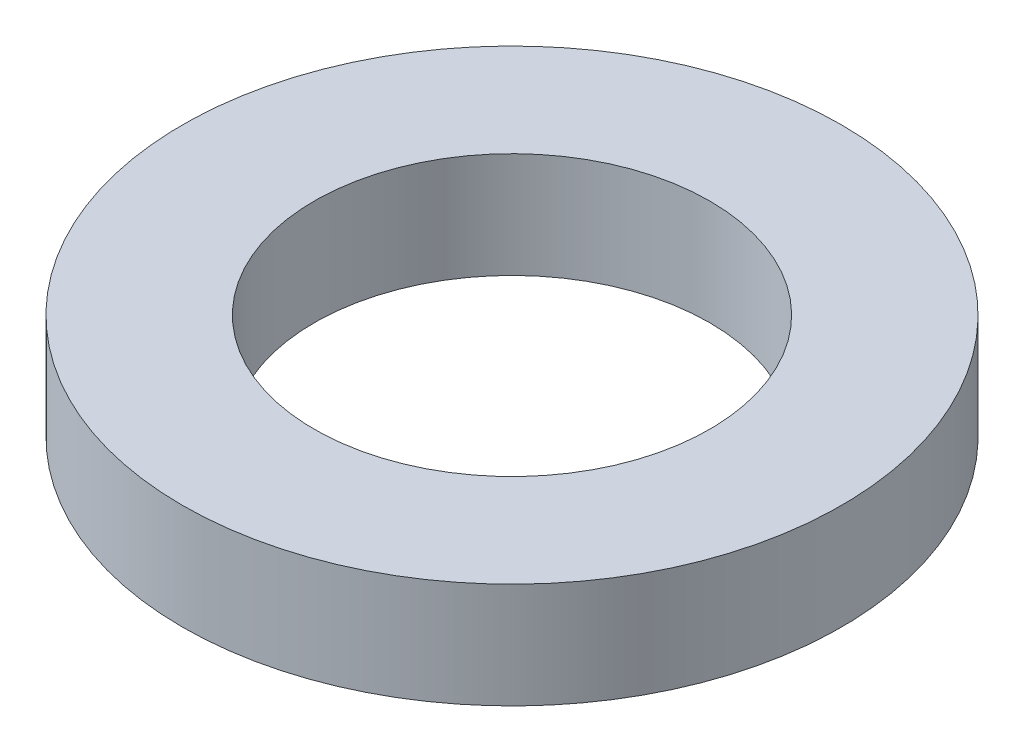
ISO-10303-21;
HEADER;
FILE_DESCRIPTION(('STEP AP214'),'2;1');
FILE_NAME('part.step','',(''),(''),'','','');
FILE_SCHEMA(('AUTOMOTIVE_DESIGN { 1 0 10303 214 1 1 1 1 }'));
ENDSEC;
DATA;
#1=APPLICATION_CONTEXT('core data for automotive mechanical design processes');
#2=APPLICATION_PROTOCOL_DEFINITION('international standard','automotive_design',2000,#1);
#3=PRODUCT_CONTEXT('',#1,'mechanical');
#4=PRODUCT('Part','Part','',(#3));
#5=PRODUCT_RELATED_PRODUCT_CATEGORY('part','',(#4));
#6=PRODUCT_DEFINITION_FORMATION('','',#4);
#7=PRODUCT_DEFINITION_CONTEXT('part definition',#1,'design');
#8=PRODUCT_DEFINITION('design','',#6,#7);
#9=PRODUCT_DEFINITION_SHAPE('','',#8);
#10=(LENGTH_UNIT() NAMED_UNIT(*) SI_UNIT(.MILLI.,.METRE.));
#11=(NAMED_UNIT(*) PLANE_ANGLE_UNIT() SI_UNIT($,.RADIAN.));
#12=(NAMED_UNIT(*) SI_UNIT($,.STERADIAN.) SOLID_ANGLE_UNIT());
#13=UNCERTAINTY_MEASURE_WITH_UNIT(LENGTH_MEASURE(1.E-05),#10,'distance_accuracy_value','');
#14=(GEOMETRIC_REPRESENTATION_CONTEXT(3) GLOBAL_UNCERTAINTY_ASSIGNED_CONTEXT((#13)) GLOBAL_UNIT_ASSIGNED_CONTEXT((#10,
#11,#12)) REPRESENTATION_CONTEXT('',''));
#15=CARTESIAN_POINT('',(0.,0.,0.));
#16=DIRECTION('',(0.,0.,1.));
#17=DIRECTION('',(1.,0.,0.));
#18=AXIS2_PLACEMENT_3D('',#15,#16,#17);
#19=CARTESIAN_POINT('',(-4.547474E-13,683.132012286217,-379.357743681072));
#20=DIRECTION('',(0.,1.,0.));
#21=DIRECTION('',(0.,0.,1.));
#22=AXIS2_PLACEMENT_3D('',#19,#20,#21);
#23=PLANE('',#22);
#24=CARTESIAN_POINT('',(-4.5449628552E-13,683.132012286217,-379.357743681072));
#25=DIRECTION('',(0.,-1.,0.));
#26=DIRECTION('',(0.,0.,-1.));
#27=AXIS2_PLACEMENT_3D('',#24,#25,#26);
#28=CIRCLE('',#27,1.5);
#29=CARTESIAN_POINT('',(-4.5449628552E-13,683.132012286217,-380.857743681072));
#30=VERTEX_POINT('',#29);
#31=EDGE_CURVE('E27',#30,#30,#28,.T.);
#32=ORIENTED_EDGE('',*,*,#31,.T.);
#33=EDGE_LOOP('',(#32));
#34=FACE_BOUND('',#33,.T.);
#35=CARTESIAN_POINT('',(-4.5449628552E-13,683.132012286217,-379.357743681072));
#36=DIRECTION('',(0.,1.,0.));
#37=DIRECTION('',(0.,0.,1.));
#38=AXIS2_PLACEMENT_3D('',#35,#36,#37);
#39=CIRCLE('',#38,2.5);
#40=CARTESIAN_POINT('',(-4.5449628552E-13,683.132012286217,-376.857743681072));
#41=VERTEX_POINT('',#40);
#42=EDGE_CURVE('E18',#41,#41,#39,.F.);
#43=ORIENTED_EDGE('',*,*,#42,.F.);
#44=EDGE_LOOP('',(#43));
#45=FACE_BOUND('',#44,.T.);
#46=ADVANCED_FACE('F15',(#34,#45),#23,.T.);
#47=CARTESIAN_POINT('',(-4.547474E-13,682.732012286217,-379.357743681072));
#48=DIRECTION('',(0.,1.,0.));
#49=DIRECTION('',(0.,0.,1.));
#50=AXIS2_PLACEMENT_3D('',#47,#48,#49);
#51=CYLINDRICAL_SURFACE('',#50,2.5);
#52=CARTESIAN_POINT('',(-4.5499851448E-13,682.332012286217,-379.357743681072));
#53=DIRECTION('',(0.,1.,0.));
#54=DIRECTION('',(0.,0.,1.));
#55=AXIS2_PLACEMENT_3D('',#52,#53,#54);
#56=CIRCLE('',#55,2.5);
#57=CARTESIAN_POINT('',(-4.5499851448E-13,682.332012286217,-376.857743681072));
#58=VERTEX_POINT('',#57);
#59=EDGE_CURVE('E22',#58,#58,#56,.F.);
#60=ORIENTED_EDGE('',*,*,#59,.F.);
#61=EDGE_LOOP('',(#60));
#62=FACE_BOUND('',#61,.T.);
#63=ORIENTED_EDGE('',*,*,#42,.T.);
#64=EDGE_LOOP('',(#63));
#65=FACE_BOUND('',#64,.T.);
#66=ADVANCED_FACE('F35',(#62,#65),#51,.T.);
#67=CARTESIAN_POINT('',(-4.547474E-13,682.732012286217,-379.357743681072));
#68=DIRECTION('',(0.,-1.,0.));
#69=DIRECTION('',(0.,0.,-1.));
#70=AXIS2_PLACEMENT_3D('',#67,#68,#69);
#71=CYLINDRICAL_SURFACE('',#70,1.5);
#72=CARTESIAN_POINT('',(-4.5499851448E-13,682.332012286217,-379.357743681072));
#73=DIRECTION('',(0.,-1.,0.));
#74=DIRECTION('',(0.,0.,-1.));
#75=AXIS2_PLACEMENT_3D('',#72,#73,#74);
#76=CIRCLE('',#75,1.5);
#77=CARTESIAN_POINT('',(-4.5499851448E-13,682.332012286217,-380.857743681072));
#78=VERTEX_POINT('',#77);
#79=EDGE_CURVE('E10',#78,#78,#76,.F.);
#80=ORIENTED_EDGE('',*,*,#79,.F.);
#81=EDGE_LOOP('',(#80));
#82=FACE_BOUND('',#81,.T.);
#83=ORIENTED_EDGE('',*,*,#31,.F.);
#84=EDGE_LOOP('',(#83));
#85=FACE_BOUND('',#84,.T.);
#86=ADVANCED_FACE('F42',(#82,#85),#71,.F.);
#87=CARTESIAN_POINT('',(-4.547474E-13,682.332012286217,-379.357743681072));
#88=DIRECTION('',(0.,-1.,0.));
#89=DIRECTION('',(0.,0.,-1.));
#90=AXIS2_PLACEMENT_3D('',#87,#88,#89);
#91=PLANE('',#90);
#92=ORIENTED_EDGE('',*,*,#79,.T.);
#93=EDGE_LOOP('',(#92));
#94=FACE_BOUND('',#93,.T.);
#95=ORIENTED_EDGE('',*,*,#59,.T.);
#96=EDGE_LOOP('',(#95));
#97=FACE_BOUND('',#96,.T.);
#98=ADVANCED_FACE('F44',(#94,#97),#91,.T.);
#99=CLOSED_SHELL('',(#46,#66,#86,#98));
#100=MANIFOLD_SOLID_BREP('B1',#99);
#101=ADVANCED_BREP_SHAPE_REPRESENTATION('',(#18,#100),#14);
#102=SHAPE_DEFINITION_REPRESENTATION(#9,#101);
ENDSEC;
END-ISO-10303-21;
